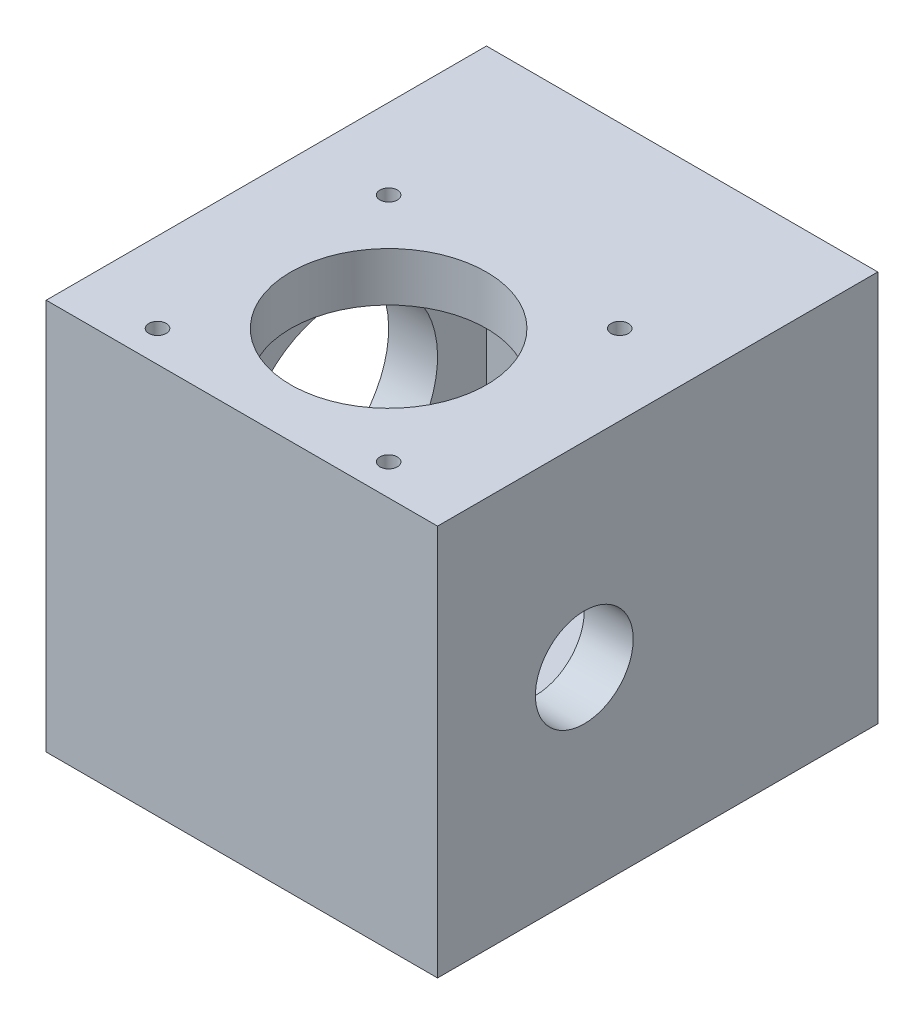
ISO-10303-21;
HEADER;
FILE_DESCRIPTION(('STEP AP214'),'2;1');
FILE_NAME('part.step','',(''),(''),'','','');
FILE_SCHEMA(('AUTOMOTIVE_DESIGN { 1 0 10303 214 1 1 1 1 }'));
ENDSEC;
DATA;
#1=APPLICATION_CONTEXT('core data for automotive mechanical design processes');
#2=APPLICATION_PROTOCOL_DEFINITION('international standard','automotive_design',2000,#1);
#3=PRODUCT_CONTEXT('',#1,'mechanical');
#4=PRODUCT('Part','Part','',(#3));
#5=PRODUCT_RELATED_PRODUCT_CATEGORY('part','',(#4));
#6=PRODUCT_DEFINITION_FORMATION('','',#4);
#7=PRODUCT_DEFINITION_CONTEXT('part definition',#1,'design');
#8=PRODUCT_DEFINITION('design','',#6,#7);
#9=PRODUCT_DEFINITION_SHAPE('','',#8);
#10=(LENGTH_UNIT() NAMED_UNIT(*) SI_UNIT(.MILLI.,.METRE.));
#11=(NAMED_UNIT(*) PLANE_ANGLE_UNIT() SI_UNIT($,.RADIAN.));
#12=(NAMED_UNIT(*) SI_UNIT($,.STERADIAN.) SOLID_ANGLE_UNIT());
#13=UNCERTAINTY_MEASURE_WITH_UNIT(LENGTH_MEASURE(1.E-05),#10,'distance_accuracy_value','');
#14=(GEOMETRIC_REPRESENTATION_CONTEXT(3) GLOBAL_UNCERTAINTY_ASSIGNED_CONTEXT((#13)) GLOBAL_UNIT_ASSIGNED_CONTEXT((#10,
#11,#12)) REPRESENTATION_CONTEXT('',''));
#15=CARTESIAN_POINT('',(0.,0.,0.));
#16=DIRECTION('',(0.,0.,1.));
#17=DIRECTION('',(1.,0.,0.));
#18=AXIS2_PLACEMENT_3D('',#15,#16,#17);
#19=CARTESIAN_POINT('',(-19.05,19.05,50.8));
#20=DIRECTION('',(1.,0.,0.));
#21=DIRECTION('',(0.,1.,0.));
#22=AXIS2_PLACEMENT_3D('',#19,#20,#21);
#23=PLANE('',#22);
#24=CARTESIAN_POINT('',(-19.05,-15.,10.4));
#25=DIRECTION('',(-1.,0.,0.));
#26=DIRECTION('',(0.,0.,1.));
#27=AXIS2_PLACEMENT_3D('',#24,#25,#26);
#28=CIRCLE('',#27,1.1303);
#29=CARTESIAN_POINT('',(-19.05,-15.,11.5303));
#30=VERTEX_POINT('',#29);
#31=EDGE_CURVE('E298',#30,#30,#28,.T.);
#32=ORIENTED_EDGE('',*,*,#31,.T.);
#33=EDGE_LOOP('',(#32));
#34=FACE_BOUND('',#33,.T.);
#35=CARTESIAN_POINT('',(-19.05,15.,10.4));
#36=DIRECTION('',(-1.,0.,0.));
#37=DIRECTION('',(0.,0.,1.));
#38=AXIS2_PLACEMENT_3D('',#35,#36,#37);
#39=CIRCLE('',#38,1.1303);
#40=CARTESIAN_POINT('',(-19.05,15.,11.5303));
#41=VERTEX_POINT('',#40);
#42=EDGE_CURVE('E290',#41,#41,#39,.T.);
#43=ORIENTED_EDGE('',*,*,#42,.T.);
#44=EDGE_LOOP('',(#43));
#45=FACE_BOUND('',#44,.T.);
#46=DIRECTION('',(0.,-1.,0.));
#47=VECTOR('',#46,1.);
#48=CARTESIAN_POINT('',(-19.05,19.05,6.35));
#49=LINE('',#48,#47);
#50=CARTESIAN_POINT('',(-19.05,19.05,6.35));
#51=VERTEX_POINT('',#50);
#52=CARTESIAN_POINT('',(-19.05,-19.05,6.35));
#53=VERTEX_POINT('',#52);
#54=EDGE_CURVE('E241',#51,#53,#49,.T.);
#55=ORIENTED_EDGE('',*,*,#54,.F.);
#56=DIRECTION('',(0.,0.,-1.));
#57=VECTOR('',#56,1.);
#58=CARTESIAN_POINT('',(-19.05,19.05,50.8));
#59=LINE('',#58,#57);
#60=CARTESIAN_POINT('',(-19.05,19.05,50.8));
#61=VERTEX_POINT('',#60);
#62=EDGE_CURVE('E128',#61,#51,#59,.T.);
#63=ORIENTED_EDGE('',*,*,#62,.F.);
#64=DIRECTION('',(0.,-1.,0.));
#65=VECTOR('',#64,1.);
#66=CARTESIAN_POINT('',(-19.05,19.05,50.8));
#67=LINE('',#66,#65);
#68=CARTESIAN_POINT('',(-19.05,-19.05,50.8));
#69=VERTEX_POINT('',#68);
#70=EDGE_CURVE('E112',#61,#69,#67,.T.);
#71=ORIENTED_EDGE('',*,*,#70,.T.);
#72=DIRECTION('',(0.,0.,-1.));
#73=VECTOR('',#72,1.);
#74=CARTESIAN_POINT('',(-19.05,-19.05,50.8));
#75=LINE('',#74,#73);
#76=EDGE_CURVE('E125',#69,#53,#75,.T.);
#77=ORIENTED_EDGE('',*,*,#76,.T.);
#78=EDGE_LOOP('',(#55,#63,#71,#77));
#79=FACE_BOUND('',#78,.T.);
#80=CARTESIAN_POINT('',(-19.05,0.,25.4));
#81=DIRECTION('',(-1.,0.,0.));
#82=DIRECTION('',(0.,-1.,0.));
#83=AXIS2_PLACEMENT_3D('',#80,#81,#82);
#84=CIRCLE('',#83,12.7);
#85=CARTESIAN_POINT('',(-19.05,-12.7,25.4));
#86=VERTEX_POINT('',#85);
#87=EDGE_CURVE('E243',#86,#86,#84,.T.);
#88=ORIENTED_EDGE('',*,*,#87,.T.);
#89=EDGE_LOOP('',(#88));
#90=FACE_BOUND('',#89,.T.);
#91=CARTESIAN_POINT('',(-19.05,-15.,40.4));
#92=DIRECTION('',(-1.,0.,0.));
#93=DIRECTION('',(0.,0.,1.));
#94=AXIS2_PLACEMENT_3D('',#91,#92,#93);
#95=CIRCLE('',#94,1.1303);
#96=CARTESIAN_POINT('',(-19.05,-15.,41.5303));
#97=VERTEX_POINT('',#96);
#98=EDGE_CURVE('E260',#97,#97,#95,.T.);
#99=ORIENTED_EDGE('',*,*,#98,.T.);
#100=EDGE_LOOP('',(#99));
#101=FACE_BOUND('',#100,.T.);
#102=CARTESIAN_POINT('',(-19.05,15.,40.4));
#103=DIRECTION('',(-1.,0.,0.));
#104=DIRECTION('',(0.,0.,1.));
#105=AXIS2_PLACEMENT_3D('',#102,#103,#104);
#106=CIRCLE('',#105,1.1303);
#107=CARTESIAN_POINT('',(-19.05,15.,41.5303));
#108=VERTEX_POINT('',#107);
#109=EDGE_CURVE('E282',#108,#108,#106,.T.);
#110=ORIENTED_EDGE('',*,*,#109,.T.);
#111=EDGE_LOOP('',(#110));
#112=FACE_BOUND('',#111,.T.);
#113=ADVANCED_FACE('F32',(#34,#45,#79,#90,#101,#112),#23,.T.);
#114=CARTESIAN_POINT('',(19.05,19.05,50.8));
#115=DIRECTION('',(-1.,0.,0.));
#116=DIRECTION('',(0.,-1.,0.));
#117=AXIS2_PLACEMENT_3D('',#114,#115,#116);
#118=PLANE('',#117);
#119=DIRECTION('',(0.,1.,0.));
#120=VECTOR('',#119,1.);
#121=CARTESIAN_POINT('',(19.05,19.05,6.35));
#122=LINE('',#121,#120);
#123=CARTESIAN_POINT('',(19.05,-19.05,6.35));
#124=VERTEX_POINT('',#123);
#125=CARTESIAN_POINT('',(19.05,19.05,6.35));
#126=VERTEX_POINT('',#125);
#127=EDGE_CURVE('E245',#124,#126,#122,.T.);
#128=ORIENTED_EDGE('',*,*,#127,.F.);
#129=DIRECTION('',(0.,0.,-1.));
#130=VECTOR('',#129,1.);
#131=CARTESIAN_POINT('',(19.05,-19.05,50.8));
#132=LINE('',#131,#130);
#133=CARTESIAN_POINT('',(19.05,-19.05,50.8));
#134=VERTEX_POINT('',#133);
#135=EDGE_CURVE('E134',#134,#124,#132,.T.);
#136=ORIENTED_EDGE('',*,*,#135,.F.);
#137=DIRECTION('',(0.,1.,0.));
#138=VECTOR('',#137,1.);
#139=CARTESIAN_POINT('',(19.05,19.05,50.8));
#140=LINE('',#139,#138);
#141=CARTESIAN_POINT('',(19.05,19.05,50.8));
#142=VERTEX_POINT('',#141);
#143=EDGE_CURVE('E114',#134,#142,#140,.T.);
#144=ORIENTED_EDGE('',*,*,#143,.T.);
#145=DIRECTION('',(0.,0.,-1.));
#146=VECTOR('',#145,1.);
#147=CARTESIAN_POINT('',(19.05,19.05,50.8));
#148=LINE('',#147,#146);
#149=EDGE_CURVE('E139',#142,#126,#148,.T.);
#150=ORIENTED_EDGE('',*,*,#149,.T.);
#151=EDGE_LOOP('',(#128,#136,#144,#150));
#152=FACE_BOUND('',#151,.T.);
#153=CARTESIAN_POINT('',(19.05,0.,38.1));
#154=DIRECTION('',(-1.,0.,0.));
#155=DIRECTION('',(0.,-1.,0.));
#156=AXIS2_PLACEMENT_3D('',#153,#154,#155);
#157=CIRCLE('',#156,6.35);
#158=CARTESIAN_POINT('',(19.05,-6.34999999999999,38.1));
#159=VERTEX_POINT('',#158);
#160=EDGE_CURVE('E251',#159,#159,#157,.F.);
#161=ORIENTED_EDGE('',*,*,#160,.T.);
#162=EDGE_LOOP('',(#161));
#163=FACE_BOUND('',#162,.T.);
#164=ADVANCED_FACE('F184',(#152,#163),#118,.T.);
#165=CARTESIAN_POINT('',(25.4,-25.4,57.15));
#166=DIRECTION('',(-1.,0.,0.));
#167=DIRECTION('',(0.,0.,1.));
#168=AXIS2_PLACEMENT_3D('',#165,#166,#167);
#169=PLANE('',#168);
#170=CARTESIAN_POINT('',(25.4,0.,38.1));
#171=DIRECTION('',(1.,0.,0.));
#172=DIRECTION('',(0.,0.,-1.));
#173=AXIS2_PLACEMENT_3D('',#170,#171,#172);
#174=CIRCLE('',#173,6.35);
#175=CARTESIAN_POINT('',(25.4,0.,31.75));
#176=VERTEX_POINT('',#175);
#177=EDGE_CURVE('E254',#176,#176,#174,.T.);
#178=ORIENTED_EDGE('',*,*,#177,.F.);
#179=EDGE_LOOP('',(#178));
#180=FACE_BOUND('',#179,.T.);
#181=DIRECTION('',(0.,1.,0.));
#182=VECTOR('',#181,1.);
#183=CARTESIAN_POINT('',(25.4,-25.4,0.));
#184=LINE('',#183,#182);
#185=CARTESIAN_POINT('',(25.4,-25.4,0.));
#186=VERTEX_POINT('',#185);
#187=CARTESIAN_POINT('',(25.4,25.4,0.));
#188=VERTEX_POINT('',#187);
#189=EDGE_CURVE('E133',#186,#188,#184,.T.);
#190=ORIENTED_EDGE('',*,*,#189,.T.);
#191=DIRECTION('',(0.,0.,-1.));
#192=VECTOR('',#191,1.);
#193=CARTESIAN_POINT('',(25.4,25.4,57.15));
#194=LINE('',#193,#192);
#195=CARTESIAN_POINT('',(25.4,25.4,57.15));
#196=VERTEX_POINT('',#195);
#197=EDGE_CURVE('E11',#196,#188,#194,.T.);
#198=ORIENTED_EDGE('',*,*,#197,.F.);
#199=DIRECTION('',(0.,1.,0.));
#200=VECTOR('',#199,1.);
#201=CARTESIAN_POINT('',(25.4,-25.4,57.15));
#202=LINE('',#201,#200);
#203=CARTESIAN_POINT('',(25.4,-25.4,57.15));
#204=VERTEX_POINT('',#203);
#205=EDGE_CURVE('E143',#204,#196,#202,.T.);
#206=ORIENTED_EDGE('',*,*,#205,.F.);
#207=DIRECTION('',(0.,0.,-1.));
#208=VECTOR('',#207,1.);
#209=CARTESIAN_POINT('',(25.4,-25.4,57.15));
#210=LINE('',#209,#208);
#211=EDGE_CURVE('E148',#204,#186,#210,.T.);
#212=ORIENTED_EDGE('',*,*,#211,.T.);
#213=EDGE_LOOP('',(#190,#198,#206,#212));
#214=FACE_BOUND('',#213,.T.);
#215=ADVANCED_FACE('F34',(#180,#214),#169,.F.);
#216=CARTESIAN_POINT('',(25.4,25.4,57.15));
#217=DIRECTION('',(0.,-1.,0.));
#218=DIRECTION('',(1.,0.,0.));
#219=AXIS2_PLACEMENT_3D('',#216,#217,#218);
#220=PLANE('',#219);
#221=CARTESIAN_POINT('',(-15.,25.4,23.1));
#222=DIRECTION('',(0.,1.,0.));
#223=DIRECTION('',(0.,0.,1.));
#224=AXIS2_PLACEMENT_3D('',#221,#222,#223);
#225=CIRCLE('',#224,1.13029999999999);
#226=CARTESIAN_POINT('',(-15.,25.4,24.2303));
#227=VERTEX_POINT('',#226);
#228=EDGE_CURVE('E320',#227,#227,#225,.T.);
#229=ORIENTED_EDGE('',*,*,#228,.F.);
#230=EDGE_LOOP('',(#229));
#231=FACE_BOUND('',#230,.T.);
#232=CARTESIAN_POINT('',(15.,25.4,23.1));
#233=DIRECTION('',(0.,1.,0.));
#234=DIRECTION('',(0.,0.,1.));
#235=AXIS2_PLACEMENT_3D('',#232,#233,#234);
#236=CIRCLE('',#235,1.13029999999999);
#237=CARTESIAN_POINT('',(15.,25.4,24.2303));
#238=VERTEX_POINT('',#237);
#239=EDGE_CURVE('E316',#238,#238,#236,.T.);
#240=ORIENTED_EDGE('',*,*,#239,.F.);
#241=EDGE_LOOP('',(#240));
#242=FACE_BOUND('',#241,.T.);
#243=CARTESIAN_POINT('',(15.,25.4,53.1));
#244=DIRECTION('',(0.,1.,0.));
#245=DIRECTION('',(0.,0.,1.));
#246=AXIS2_PLACEMENT_3D('',#243,#244,#245);
#247=CIRCLE('',#246,1.13029999999999);
#248=CARTESIAN_POINT('',(15.,25.4,54.2303));
#249=VERTEX_POINT('',#248);
#250=EDGE_CURVE('E312',#249,#249,#247,.T.);
#251=ORIENTED_EDGE('',*,*,#250,.F.);
#252=EDGE_LOOP('',(#251));
#253=FACE_BOUND('',#252,.T.);
#254=CARTESIAN_POINT('',(-15.,25.4,53.1));
#255=DIRECTION('',(0.,1.,0.));
#256=DIRECTION('',(0.,0.,1.));
#257=AXIS2_PLACEMENT_3D('',#254,#255,#256);
#258=CIRCLE('',#257,1.13029999999999);
#259=CARTESIAN_POINT('',(-15.,25.4,54.2303));
#260=VERTEX_POINT('',#259);
#261=EDGE_CURVE('E306',#260,#260,#258,.T.);
#262=ORIENTED_EDGE('',*,*,#261,.F.);
#263=EDGE_LOOP('',(#262));
#264=FACE_BOUND('',#263,.T.);
#265=CARTESIAN_POINT('',(0.,25.4,38.1));
#266=DIRECTION('',(0.,1.,0.));
#267=DIRECTION('',(-1.,0.,0.));
#268=AXIS2_PLACEMENT_3D('',#265,#266,#267);
#269=CIRCLE('',#268,12.7);
#270=CARTESIAN_POINT('',(-12.7,25.4,38.1));
#271=VERTEX_POINT('',#270);
#272=EDGE_CURVE('E265',#271,#271,#269,.T.);
#273=ORIENTED_EDGE('',*,*,#272,.F.);
#274=EDGE_LOOP('',(#273));
#275=FACE_BOUND('',#274,.T.);
#276=DIRECTION('',(-1.,0.,0.));
#277=VECTOR('',#276,1.);
#278=CARTESIAN_POINT('',(25.4,25.4,0.));
#279=LINE('',#278,#277);
#280=CARTESIAN_POINT('',(-25.4,25.4,0.));
#281=VERTEX_POINT('',#280);
#282=EDGE_CURVE('E137',#188,#281,#279,.T.);
#283=ORIENTED_EDGE('',*,*,#282,.T.);
#284=DIRECTION('',(0.,0.,-1.));
#285=VECTOR('',#284,1.);
#286=CARTESIAN_POINT('',(-25.4,25.4,57.15));
#287=LINE('',#286,#285);
#288=CARTESIAN_POINT('',(-25.4,25.4,57.15));
#289=VERTEX_POINT('',#288);
#290=EDGE_CURVE('E40',#289,#281,#287,.T.);
#291=ORIENTED_EDGE('',*,*,#290,.F.);
#292=DIRECTION('',(-1.,0.,0.));
#293=VECTOR('',#292,1.);
#294=CARTESIAN_POINT('',(25.4,25.4,57.15));
#295=LINE('',#294,#293);
#296=EDGE_CURVE('E81',#196,#289,#295,.T.);
#297=ORIENTED_EDGE('',*,*,#296,.F.);
#298=ORIENTED_EDGE('',*,*,#197,.T.);
#299=EDGE_LOOP('',(#283,#291,#297,#298));
#300=FACE_BOUND('',#299,.T.);
#301=ADVANCED_FACE('F178',(#231,#242,#253,#264,#275,#300),#220,.F.);
#302=CARTESIAN_POINT('',(-25.4,-25.4,57.15));
#303=DIRECTION('',(1.,0.,0.));
#304=DIRECTION('',(0.,1.,0.));
#305=AXIS2_PLACEMENT_3D('',#302,#303,#304);
#306=PLANE('',#305);
#307=CARTESIAN_POINT('',(-25.4,-15.,10.4));
#308=DIRECTION('',(-1.,0.,0.));
#309=DIRECTION('',(0.,0.,1.));
#310=AXIS2_PLACEMENT_3D('',#307,#308,#309);
#311=CIRCLE('',#310,1.1303);
#312=CARTESIAN_POINT('',(-25.4,-15.,11.5303));
#313=VERTEX_POINT('',#312);
#314=EDGE_CURVE('E300',#313,#313,#311,.T.);
#315=ORIENTED_EDGE('',*,*,#314,.F.);
#316=EDGE_LOOP('',(#315));
#317=FACE_BOUND('',#316,.T.);
#318=CARTESIAN_POINT('',(-25.4,15.,10.4));
#319=DIRECTION('',(-1.,0.,0.));
#320=DIRECTION('',(0.,0.,1.));
#321=AXIS2_PLACEMENT_3D('',#318,#319,#320);
#322=CIRCLE('',#321,1.1303);
#323=CARTESIAN_POINT('',(-25.4,15.,11.5303));
#324=VERTEX_POINT('',#323);
#325=EDGE_CURVE('E295',#324,#324,#322,.T.);
#326=ORIENTED_EDGE('',*,*,#325,.F.);
#327=EDGE_LOOP('',(#326));
#328=FACE_BOUND('',#327,.T.);
#329=CARTESIAN_POINT('',(-25.4,15.,40.4));
#330=DIRECTION('',(-1.,0.,0.));
#331=DIRECTION('',(0.,0.,1.));
#332=AXIS2_PLACEMENT_3D('',#329,#330,#331);
#333=CIRCLE('',#332,1.1303);
#334=CARTESIAN_POINT('',(-25.4,15.,41.5303));
#335=VERTEX_POINT('',#334);
#336=EDGE_CURVE('E285',#335,#335,#333,.T.);
#337=ORIENTED_EDGE('',*,*,#336,.F.);
#338=EDGE_LOOP('',(#337));
#339=FACE_BOUND('',#338,.T.);
#340=CARTESIAN_POINT('',(-25.4,-15.,40.4));
#341=DIRECTION('',(-1.,0.,0.));
#342=DIRECTION('',(0.,0.,1.));
#343=AXIS2_PLACEMENT_3D('',#340,#341,#342);
#344=CIRCLE('',#343,1.1303);
#345=CARTESIAN_POINT('',(-25.4,-15.,41.5303));
#346=VERTEX_POINT('',#345);
#347=EDGE_CURVE('E284',#346,#346,#344,.T.);
#348=ORIENTED_EDGE('',*,*,#347,.F.);
#349=EDGE_LOOP('',(#348));
#350=FACE_BOUND('',#349,.T.);
#351=CARTESIAN_POINT('',(-25.4,0.,25.4));
#352=DIRECTION('',(-1.,0.,0.));
#353=DIRECTION('',(0.,-1.,0.));
#354=AXIS2_PLACEMENT_3D('',#351,#352,#353);
#355=CIRCLE('',#354,12.7);
#356=CARTESIAN_POINT('',(-25.4,-12.7,25.4));
#357=VERTEX_POINT('',#356);
#358=EDGE_CURVE('E268',#357,#357,#355,.T.);
#359=ORIENTED_EDGE('',*,*,#358,.F.);
#360=EDGE_LOOP('',(#359));
#361=FACE_BOUND('',#360,.T.);
#362=DIRECTION('',(0.,-1.,0.));
#363=VECTOR('',#362,1.);
#364=CARTESIAN_POINT('',(-25.4,-25.4,0.));
#365=LINE('',#364,#363);
#366=CARTESIAN_POINT('',(-25.4,-25.4,0.));
#367=VERTEX_POINT('',#366);
#368=EDGE_CURVE('E151',#281,#367,#365,.T.);
#369=ORIENTED_EDGE('',*,*,#368,.T.);
#370=DIRECTION('',(0.,0.,-1.));
#371=VECTOR('',#370,1.);
#372=CARTESIAN_POINT('',(-25.4,-25.4,57.15));
#373=LINE('',#372,#371);
#374=CARTESIAN_POINT('',(-25.4,-25.4,57.15));
#375=VERTEX_POINT('',#374);
#376=EDGE_CURVE('E155',#375,#367,#373,.T.);
#377=ORIENTED_EDGE('',*,*,#376,.F.);
#378=DIRECTION('',(0.,-1.,0.));
#379=VECTOR('',#378,1.);
#380=CARTESIAN_POINT('',(-25.4,-25.4,57.15));
#381=LINE('',#380,#379);
#382=EDGE_CURVE('E146',#289,#375,#381,.T.);
#383=ORIENTED_EDGE('',*,*,#382,.F.);
#384=ORIENTED_EDGE('',*,*,#290,.T.);
#385=EDGE_LOOP('',(#369,#377,#383,#384));
#386=FACE_BOUND('',#385,.T.);
#387=ADVANCED_FACE('F160',(#317,#328,#339,#350,#361,#386),#306,.F.);
#388=CARTESIAN_POINT('',(25.4,-25.4,57.15));
#389=DIRECTION('',(0.,1.,0.));
#390=DIRECTION('',(-1.,0.,0.));
#391=AXIS2_PLACEMENT_3D('',#388,#389,#390);
#392=PLANE('',#391);
#393=CARTESIAN_POINT('',(0.,-25.4,31.75));
#394=DIRECTION('',(0.,-1.,0.));
#395=DIRECTION('',(1.,0.,0.));
#396=AXIS2_PLACEMENT_3D('',#393,#394,#395);
#397=CIRCLE('',#396,6.35);
#398=CARTESIAN_POINT('',(6.35,-25.4,31.75));
#399=VERTEX_POINT('',#398);
#400=EDGE_CURVE('E253',#399,#399,#397,.T.);
#401=ORIENTED_EDGE('',*,*,#400,.F.);
#402=EDGE_LOOP('',(#401));
#403=FACE_BOUND('',#402,.T.);
#404=DIRECTION('',(1.,0.,0.));
#405=VECTOR('',#404,1.);
#406=CARTESIAN_POINT('',(25.4,-25.4,0.));
#407=LINE('',#406,#405);
#408=EDGE_CURVE('E74',#367,#186,#407,.T.);
#409=ORIENTED_EDGE('',*,*,#408,.T.);
#410=ORIENTED_EDGE('',*,*,#211,.F.);
#411=DIRECTION('',(1.,0.,0.));
#412=VECTOR('',#411,1.);
#413=CARTESIAN_POINT('',(25.4,-25.4,57.15));
#414=LINE('',#413,#412);
#415=EDGE_CURVE('E53',#375,#204,#414,.T.);
#416=ORIENTED_EDGE('',*,*,#415,.F.);
#417=ORIENTED_EDGE('',*,*,#376,.T.);
#418=EDGE_LOOP('',(#409,#410,#416,#417));
#419=FACE_BOUND('',#418,.T.);
#420=ADVANCED_FACE('F168',(#403,#419),#392,.F.);
#421=CARTESIAN_POINT('',(0.,0.,57.15));
#422=DIRECTION('',(0.,0.,1.));
#423=DIRECTION('',(1.,0.,0.));
#424=AXIS2_PLACEMENT_3D('',#421,#422,#423);
#425=PLANE('',#424);
#426=ORIENTED_EDGE('',*,*,#205,.T.);
#427=ORIENTED_EDGE('',*,*,#296,.T.);
#428=ORIENTED_EDGE('',*,*,#382,.T.);
#429=ORIENTED_EDGE('',*,*,#415,.T.);
#430=EDGE_LOOP('',(#426,#427,#428,#429));
#431=FACE_BOUND('',#430,.T.);
#432=ADVANCED_FACE('F170',(#431),#425,.T.);
#433=CARTESIAN_POINT('',(0.,0.,0.));
#434=DIRECTION('',(0.,0.,1.));
#435=DIRECTION('',(1.,0.,0.));
#436=AXIS2_PLACEMENT_3D('',#433,#434,#435);
#437=PLANE('',#436);
#438=ORIENTED_EDGE('',*,*,#189,.F.);
#439=ORIENTED_EDGE('',*,*,#408,.F.);
#440=ORIENTED_EDGE('',*,*,#368,.F.);
#441=ORIENTED_EDGE('',*,*,#282,.F.);
#442=EDGE_LOOP('',(#438,#439,#440,#441));
#443=FACE_BOUND('',#442,.T.);
#444=ADVANCED_FACE('F164',(#443),#437,.F.);
#445=CARTESIAN_POINT('',(-19.05,0.,25.4));
#446=DIRECTION('',(-1.,0.,0.));
#447=DIRECTION('',(0.,-1.,0.));
#448=AXIS2_PLACEMENT_3D('',#445,#446,#447);
#449=CYLINDRICAL_SURFACE('',#448,12.7);
#450=ORIENTED_EDGE('',*,*,#87,.F.);
#451=EDGE_LOOP('',(#450));
#452=FACE_BOUND('',#451,.T.);
#453=ORIENTED_EDGE('',*,*,#358,.T.);
#454=EDGE_LOOP('',(#453));
#455=FACE_BOUND('',#454,.T.);
#456=ADVANCED_FACE('F196',(#452,#455),#449,.F.);
#457=CARTESIAN_POINT('',(-19.05,-19.05,50.8));
#458=DIRECTION('',(0.,1.,0.));
#459=DIRECTION('',(0.,0.,1.));
#460=AXIS2_PLACEMENT_3D('',#457,#458,#459);
#461=PLANE('',#460);
#462=CARTESIAN_POINT('',(0.,-19.05,31.75));
#463=DIRECTION('',(0.,-1.,0.));
#464=DIRECTION('',(1.,0.,0.));
#465=AXIS2_PLACEMENT_3D('',#462,#463,#464);
#466=CIRCLE('',#465,6.35);
#467=CARTESIAN_POINT('',(6.35,-19.05,31.75));
#468=VERTEX_POINT('',#467);
#469=EDGE_CURVE('E257',#468,#468,#466,.T.);
#470=ORIENTED_EDGE('',*,*,#469,.T.);
#471=EDGE_LOOP('',(#470));
#472=FACE_BOUND('',#471,.T.);
#473=DIRECTION('',(1.,0.,0.));
#474=VECTOR('',#473,1.);
#475=CARTESIAN_POINT('',(-19.05,-19.05,6.35));
#476=LINE('',#475,#474);
#477=EDGE_CURVE('E132',#53,#124,#476,.T.);
#478=ORIENTED_EDGE('',*,*,#477,.F.);
#479=ORIENTED_EDGE('',*,*,#76,.F.);
#480=DIRECTION('',(1.,0.,0.));
#481=VECTOR('',#480,1.);
#482=CARTESIAN_POINT('',(-19.05,-19.05,50.8));
#483=LINE('',#482,#481);
#484=EDGE_CURVE('E108',#69,#134,#483,.T.);
#485=ORIENTED_EDGE('',*,*,#484,.T.);
#486=ORIENTED_EDGE('',*,*,#135,.T.);
#487=EDGE_LOOP('',(#478,#479,#485,#486));
#488=FACE_BOUND('',#487,.T.);
#489=ADVANCED_FACE('F131',(#472,#488),#461,.T.);
#490=CARTESIAN_POINT('',(-19.05,19.05,50.8));
#491=DIRECTION('',(0.,-1.,0.));
#492=DIRECTION('',(0.,0.,-1.));
#493=AXIS2_PLACEMENT_3D('',#490,#491,#492);
#494=PLANE('',#493);
#495=CARTESIAN_POINT('',(-15.,19.05,23.1));
#496=DIRECTION('',(0.,1.,0.));
#497=DIRECTION('',(0.,0.,1.));
#498=AXIS2_PLACEMENT_3D('',#495,#496,#497);
#499=CIRCLE('',#498,1.1303);
#500=CARTESIAN_POINT('',(-15.,19.05,24.2303));
#501=VERTEX_POINT('',#500);
#502=EDGE_CURVE('E226',#501,#501,#499,.T.);
#503=ORIENTED_EDGE('',*,*,#502,.T.);
#504=EDGE_LOOP('',(#503));
#505=FACE_BOUND('',#504,.T.);
#506=CARTESIAN_POINT('',(15.,19.05,23.1));
#507=DIRECTION('',(0.,1.,0.));
#508=DIRECTION('',(0.,0.,1.));
#509=AXIS2_PLACEMENT_3D('',#506,#507,#508);
#510=CIRCLE('',#509,1.1303);
#511=CARTESIAN_POINT('',(15.,19.05,24.2303));
#512=VERTEX_POINT('',#511);
#513=EDGE_CURVE('E230',#512,#512,#510,.T.);
#514=ORIENTED_EDGE('',*,*,#513,.T.);
#515=EDGE_LOOP('',(#514));
#516=FACE_BOUND('',#515,.T.);
#517=DIRECTION('',(-1.,0.,0.));
#518=VECTOR('',#517,1.);
#519=CARTESIAN_POINT('',(-19.05,19.05,50.8));
#520=LINE('',#519,#518);
#521=CARTESIAN_POINT('',(0.,19.05,50.8));
#522=VERTEX_POINT('',#521);
#523=EDGE_CURVE('E233',#142,#522,#520,.T.);
#524=ORIENTED_EDGE('',*,*,#523,.T.);
#525=CARTESIAN_POINT('',(0.,19.05,38.1));
#526=DIRECTION('',(0.,1.,0.));
#527=DIRECTION('',(-1.,0.,0.));
#528=AXIS2_PLACEMENT_3D('',#525,#526,#527);
#529=CIRCLE('',#528,12.7);
#530=EDGE_CURVE('E45',#522,#522,#529,.T.);
#531=ORIENTED_EDGE('',*,*,#530,.T.);
#532=EDGE_CURVE('E236',#522,#61,#520,.T.);
#533=ORIENTED_EDGE('',*,*,#532,.T.);
#534=ORIENTED_EDGE('',*,*,#62,.T.);
#535=DIRECTION('',(-1.,0.,0.));
#536=VECTOR('',#535,1.);
#537=CARTESIAN_POINT('',(-19.05,19.05,6.35));
#538=LINE('',#537,#536);
#539=EDGE_CURVE('E129',#126,#51,#538,.T.);
#540=ORIENTED_EDGE('',*,*,#539,.F.);
#541=ORIENTED_EDGE('',*,*,#149,.F.);
#542=EDGE_LOOP('',(#524,#531,#533,#534,#540,#541));
#543=FACE_BOUND('',#542,.T.);
#544=ADVANCED_FACE('F205',(#505,#516,#543),#494,.T.);
#545=CARTESIAN_POINT('',(0.,0.,50.8));
#546=DIRECTION('',(0.,0.,1.));
#547=DIRECTION('',(1.,0.,0.));
#548=AXIS2_PLACEMENT_3D('',#545,#546,#547);
#549=PLANE('',#548);
#550=ORIENTED_EDGE('',*,*,#70,.F.);
#551=ORIENTED_EDGE('',*,*,#532,.F.);
#552=ORIENTED_EDGE('',*,*,#523,.F.);
#553=ORIENTED_EDGE('',*,*,#143,.F.);
#554=ORIENTED_EDGE('',*,*,#484,.F.);
#555=EDGE_LOOP('',(#550,#551,#552,#553,#554));
#556=FACE_BOUND('',#555,.T.);
#557=ADVANCED_FACE('F110',(#556),#549,.F.);
#558=CARTESIAN_POINT('',(0.,0.,6.35));
#559=DIRECTION('',(0.,0.,1.));
#560=DIRECTION('',(1.,0.,0.));
#561=AXIS2_PLACEMENT_3D('',#558,#559,#560);
#562=PLANE('',#561);
#563=ORIENTED_EDGE('',*,*,#54,.T.);
#564=ORIENTED_EDGE('',*,*,#477,.T.);
#565=ORIENTED_EDGE('',*,*,#127,.T.);
#566=ORIENTED_EDGE('',*,*,#539,.T.);
#567=EDGE_LOOP('',(#563,#564,#565,#566));
#568=FACE_BOUND('',#567,.T.);
#569=ADVANCED_FACE('F215',(#568),#562,.T.);
#570=CARTESIAN_POINT('',(0.,19.05,38.1));
#571=DIRECTION('',(0.,1.,0.));
#572=DIRECTION('',(-1.,0.,0.));
#573=AXIS2_PLACEMENT_3D('',#570,#571,#572);
#574=CYLINDRICAL_SURFACE('',#573,12.7);
#575=ORIENTED_EDGE('',*,*,#530,.F.);
#576=EDGE_LOOP('',(#575));
#577=FACE_BOUND('',#576,.T.);
#578=ORIENTED_EDGE('',*,*,#272,.T.);
#579=EDGE_LOOP('',(#578));
#580=FACE_BOUND('',#579,.T.);
#581=ADVANCED_FACE('F211',(#577,#580),#574,.F.);
#582=CARTESIAN_POINT('',(0.,-19.05,31.75));
#583=DIRECTION('',(0.,-1.,0.));
#584=DIRECTION('',(1.,0.,0.));
#585=AXIS2_PLACEMENT_3D('',#582,#583,#584);
#586=CYLINDRICAL_SURFACE('',#585,6.35);
#587=ORIENTED_EDGE('',*,*,#469,.F.);
#588=EDGE_LOOP('',(#587));
#589=FACE_BOUND('',#588,.T.);
#590=ORIENTED_EDGE('',*,*,#400,.T.);
#591=EDGE_LOOP('',(#590));
#592=FACE_BOUND('',#591,.T.);
#593=ADVANCED_FACE('F337',(#589,#592),#586,.F.);
#594=CARTESIAN_POINT('',(25.4,0.,38.1));
#595=DIRECTION('',(1.,0.,0.));
#596=DIRECTION('',(0.,0.,-1.));
#597=AXIS2_PLACEMENT_3D('',#594,#595,#596);
#598=CYLINDRICAL_SURFACE('',#597,6.35);
#599=ORIENTED_EDGE('',*,*,#160,.F.);
#600=EDGE_LOOP('',(#599));
#601=FACE_BOUND('',#600,.T.);
#602=ORIENTED_EDGE('',*,*,#177,.T.);
#603=EDGE_LOOP('',(#602));
#604=FACE_BOUND('',#603,.T.);
#605=ADVANCED_FACE('F341',(#601,#604),#598,.F.);
#606=CARTESIAN_POINT('',(-25.4,-15.,40.4));
#607=DIRECTION('',(-1.,0.,0.));
#608=DIRECTION('',(0.,0.,1.));
#609=AXIS2_PLACEMENT_3D('',#606,#607,#608);
#610=CYLINDRICAL_SURFACE('',#609,1.1303);
#611=ORIENTED_EDGE('',*,*,#98,.F.);
#612=EDGE_LOOP('',(#611));
#613=FACE_BOUND('',#612,.T.);
#614=ORIENTED_EDGE('',*,*,#347,.T.);
#615=EDGE_LOOP('',(#614));
#616=FACE_BOUND('',#615,.T.);
#617=ADVANCED_FACE('F346',(#613,#616),#610,.F.);
#618=CARTESIAN_POINT('',(-25.4,15.,40.4));
#619=DIRECTION('',(-1.,0.,0.));
#620=DIRECTION('',(0.,0.,1.));
#621=AXIS2_PLACEMENT_3D('',#618,#619,#620);
#622=CYLINDRICAL_SURFACE('',#621,1.1303);
#623=ORIENTED_EDGE('',*,*,#109,.F.);
#624=EDGE_LOOP('',(#623));
#625=FACE_BOUND('',#624,.T.);
#626=ORIENTED_EDGE('',*,*,#336,.T.);
#627=EDGE_LOOP('',(#626));
#628=FACE_BOUND('',#627,.T.);
#629=ADVANCED_FACE('F353',(#625,#628),#622,.F.);
#630=CARTESIAN_POINT('',(-25.4,15.,10.4));
#631=DIRECTION('',(-1.,0.,0.));
#632=DIRECTION('',(0.,0.,1.));
#633=AXIS2_PLACEMENT_3D('',#630,#631,#632);
#634=CYLINDRICAL_SURFACE('',#633,1.1303);
#635=ORIENTED_EDGE('',*,*,#42,.F.);
#636=EDGE_LOOP('',(#635));
#637=FACE_BOUND('',#636,.T.);
#638=ORIENTED_EDGE('',*,*,#325,.T.);
#639=EDGE_LOOP('',(#638));
#640=FACE_BOUND('',#639,.T.);
#641=ADVANCED_FACE('F357',(#637,#640),#634,.F.);
#642=CARTESIAN_POINT('',(-25.4,-15.,10.4));
#643=DIRECTION('',(-1.,0.,0.));
#644=DIRECTION('',(0.,0.,1.));
#645=AXIS2_PLACEMENT_3D('',#642,#643,#644);
#646=CYLINDRICAL_SURFACE('',#645,1.1303);
#647=ORIENTED_EDGE('',*,*,#31,.F.);
#648=EDGE_LOOP('',(#647));
#649=FACE_BOUND('',#648,.T.);
#650=ORIENTED_EDGE('',*,*,#314,.T.);
#651=EDGE_LOOP('',(#650));
#652=FACE_BOUND('',#651,.T.);
#653=ADVANCED_FACE('F360',(#649,#652),#646,.F.);
#654=CARTESIAN_POINT('',(-15.,19.05,53.1));
#655=DIRECTION('',(0.,-1.,0.));
#656=DIRECTION('',(0.,0.,-1.));
#657=AXIS2_PLACEMENT_3D('',#654,#655,#656);
#658=PLANE('',#657);
#659=CARTESIAN_POINT('',(-15.,19.05,53.1));
#660=DIRECTION('',(0.,1.,0.));
#661=DIRECTION('',(0.,0.,1.));
#662=AXIS2_PLACEMENT_3D('',#659,#660,#661);
#663=CIRCLE('',#662,1.1303);
#664=CARTESIAN_POINT('',(-15.,19.05,54.2303));
#665=VERTEX_POINT('',#664);
#666=EDGE_CURVE('E303',#665,#665,#663,.T.);
#667=ORIENTED_EDGE('',*,*,#666,.T.);
#668=EDGE_LOOP('',(#667));
#669=FACE_BOUND('',#668,.T.);
#670=ADVANCED_FACE('F364',(#669),#658,.F.);
#671=CARTESIAN_POINT('',(-15.,25.4,53.1));
#672=DIRECTION('',(0.,1.,0.));
#673=DIRECTION('',(0.,0.,1.));
#674=AXIS2_PLACEMENT_3D('',#671,#672,#673);
#675=CYLINDRICAL_SURFACE('',#674,1.13029999999999);
#676=ORIENTED_EDGE('',*,*,#666,.F.);
#677=EDGE_LOOP('',(#676));
#678=FACE_BOUND('',#677,.T.);
#679=ORIENTED_EDGE('',*,*,#261,.T.);
#680=EDGE_LOOP('',(#679));
#681=FACE_BOUND('',#680,.T.);
#682=ADVANCED_FACE('F368',(#678,#681),#675,.F.);
#683=CARTESIAN_POINT('',(15.,19.05,53.1));
#684=DIRECTION('',(0.,-1.,0.));
#685=DIRECTION('',(0.,0.,-1.));
#686=AXIS2_PLACEMENT_3D('',#683,#684,#685);
#687=PLANE('',#686);
#688=CARTESIAN_POINT('',(15.,19.05,53.1));
#689=DIRECTION('',(0.,1.,0.));
#690=DIRECTION('',(0.,0.,1.));
#691=AXIS2_PLACEMENT_3D('',#688,#689,#690);
#692=CIRCLE('',#691,1.1303);
#693=CARTESIAN_POINT('',(15.,19.05,54.2303));
#694=VERTEX_POINT('',#693);
#695=EDGE_CURVE('E309',#694,#694,#692,.T.);
#696=ORIENTED_EDGE('',*,*,#695,.T.);
#697=EDGE_LOOP('',(#696));
#698=FACE_BOUND('',#697,.T.);
#699=ADVANCED_FACE('F372',(#698),#687,.F.);
#700=CARTESIAN_POINT('',(15.,25.4,53.1));
#701=DIRECTION('',(0.,1.,0.));
#702=DIRECTION('',(0.,0.,1.));
#703=AXIS2_PLACEMENT_3D('',#700,#701,#702);
#704=CYLINDRICAL_SURFACE('',#703,1.13029999999999);
#705=ORIENTED_EDGE('',*,*,#695,.F.);
#706=EDGE_LOOP('',(#705));
#707=FACE_BOUND('',#706,.T.);
#708=ORIENTED_EDGE('',*,*,#250,.T.);
#709=EDGE_LOOP('',(#708));
#710=FACE_BOUND('',#709,.T.);
#711=ADVANCED_FACE('F376',(#707,#710),#704,.F.);
#712=CARTESIAN_POINT('',(15.,25.4,23.1));
#713=DIRECTION('',(0.,1.,0.));
#714=DIRECTION('',(0.,0.,1.));
#715=AXIS2_PLACEMENT_3D('',#712,#713,#714);
#716=CYLINDRICAL_SURFACE('',#715,1.13029999999999);
#717=ORIENTED_EDGE('',*,*,#513,.F.);
#718=EDGE_LOOP('',(#717));
#719=FACE_BOUND('',#718,.T.);
#720=ORIENTED_EDGE('',*,*,#239,.T.);
#721=EDGE_LOOP('',(#720));
#722=FACE_BOUND('',#721,.T.);
#723=ADVANCED_FACE('F380',(#719,#722),#716,.F.);
#724=CARTESIAN_POINT('',(-15.,25.4,23.1));
#725=DIRECTION('',(0.,1.,0.));
#726=DIRECTION('',(0.,0.,1.));
#727=AXIS2_PLACEMENT_3D('',#724,#725,#726);
#728=CYLINDRICAL_SURFACE('',#727,1.13029999999999);
#729=ORIENTED_EDGE('',*,*,#502,.F.);
#730=EDGE_LOOP('',(#729));
#731=FACE_BOUND('',#730,.T.);
#732=ORIENTED_EDGE('',*,*,#228,.T.);
#733=EDGE_LOOP('',(#732));
#734=FACE_BOUND('',#733,.T.);
#735=ADVANCED_FACE('F324',(#731,#734),#728,.F.);
#736=CLOSED_SHELL('',(#113,#164,#215,#301,#387,#420,#432,#444,#456,#489,#544,#557,#569,#581,
#593,#605,#617,#629,#641,#653,#670,#682,#699,#711,#723,#735));
#737=MANIFOLD_SOLID_BREP('B2',#736);
#738=ADVANCED_BREP_SHAPE_REPRESENTATION('',(#18,#737),#14);
#739=SHAPE_DEFINITION_REPRESENTATION(#9,#738);
ENDSEC;
END-ISO-10303-21;
